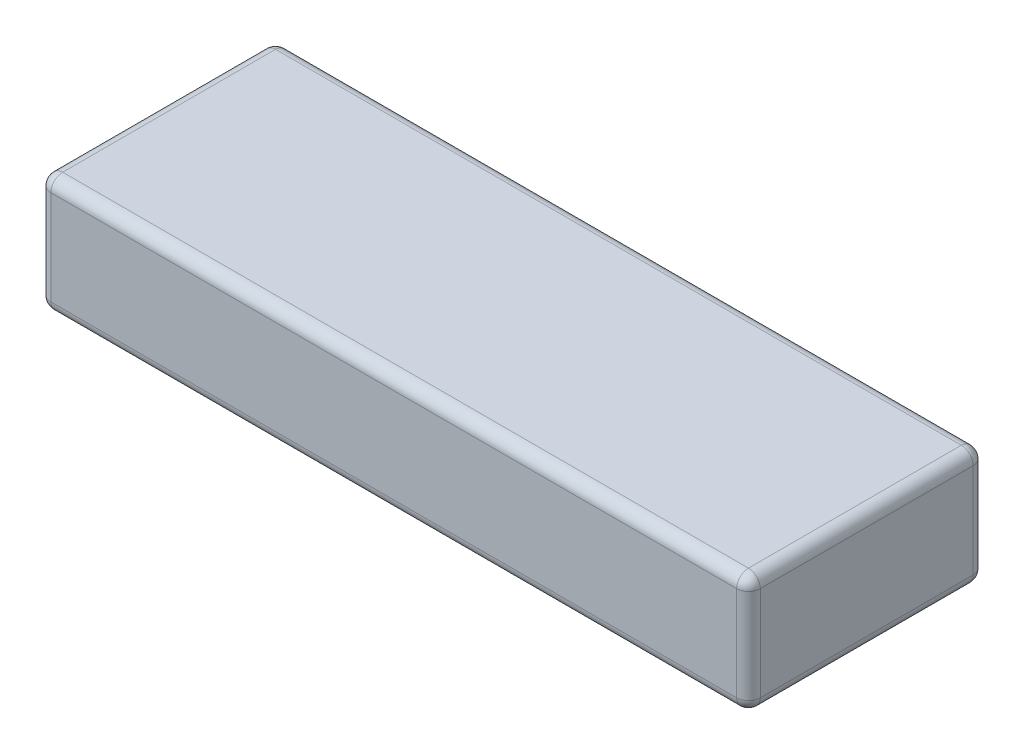
ISO-10303-21;
HEADER;
FILE_DESCRIPTION(('STEP AP214'),'2;1');
FILE_NAME('part.step','',(''),(''),'','','');
FILE_SCHEMA(('AUTOMOTIVE_DESIGN { 1 0 10303 214 1 1 1 1 }'));
ENDSEC;
DATA;
#1=APPLICATION_CONTEXT('core data for automotive mechanical design processes');
#2=APPLICATION_PROTOCOL_DEFINITION('international standard','automotive_design',2000,#1);
#3=PRODUCT_CONTEXT('',#1,'mechanical');
#4=PRODUCT('Part','Part','',(#3));
#5=PRODUCT_RELATED_PRODUCT_CATEGORY('part','',(#4));
#6=PRODUCT_DEFINITION_FORMATION('','',#4);
#7=PRODUCT_DEFINITION_CONTEXT('part definition',#1,'design');
#8=PRODUCT_DEFINITION('design','',#6,#7);
#9=PRODUCT_DEFINITION_SHAPE('','',#8);
#10=(LENGTH_UNIT() NAMED_UNIT(*) SI_UNIT(.MILLI.,.METRE.));
#11=(NAMED_UNIT(*) PLANE_ANGLE_UNIT() SI_UNIT($,.RADIAN.));
#12=(NAMED_UNIT(*) SI_UNIT($,.STERADIAN.) SOLID_ANGLE_UNIT());
#13=UNCERTAINTY_MEASURE_WITH_UNIT(LENGTH_MEASURE(1.E-05),#10,'distance_accuracy_value','');
#14=(GEOMETRIC_REPRESENTATION_CONTEXT(3) GLOBAL_UNCERTAINTY_ASSIGNED_CONTEXT((#13)) GLOBAL_UNIT_ASSIGNED_CONTEXT((#10,
#11,#12)) REPRESENTATION_CONTEXT('',''));
#15=CARTESIAN_POINT('',(0.,0.,0.));
#16=DIRECTION('',(0.,0.,1.));
#17=DIRECTION('',(1.,0.,0.));
#18=AXIS2_PLACEMENT_3D('',#15,#16,#17);
#19=CARTESIAN_POINT('',(15.,5.,5.));
#20=DIRECTION('',(-1.,0.,0.));
#21=DIRECTION('',(0.,0.,1.));
#22=AXIS2_PLACEMENT_3D('',#19,#20,#21);
#23=PLANE('',#22);
#24=DIRECTION('',(0.,0.,-1.));
#25=VECTOR('',#24,1.);
#26=CARTESIAN_POINT('',(15.,0.5,-5.));
#27=LINE('',#26,#25);
#28=CARTESIAN_POINT('',(15.,0.5,4.5));
#29=VERTEX_POINT('',#28);
#30=CARTESIAN_POINT('',(15.,0.5,-4.5));
#31=VERTEX_POINT('',#30);
#32=EDGE_CURVE('E188',#29,#31,#27,.T.);
#33=ORIENTED_EDGE('',*,*,#32,.T.);
#34=DIRECTION('',(0.,-1.,0.));
#35=VECTOR('',#34,1.);
#36=CARTESIAN_POINT('',(15.,5.,-4.5));
#37=LINE('',#36,#35);
#38=CARTESIAN_POINT('',(15.,4.5,-4.5));
#39=VERTEX_POINT('',#38);
#40=EDGE_CURVE('E191',#31,#39,#37,.F.);
#41=ORIENTED_EDGE('',*,*,#40,.T.);
#42=DIRECTION('',(0.,0.,-1.));
#43=VECTOR('',#42,1.);
#44=CARTESIAN_POINT('',(15.,4.5,5.));
#45=LINE('',#44,#43);
#46=CARTESIAN_POINT('',(15.,4.5,4.5));
#47=VERTEX_POINT('',#46);
#48=EDGE_CURVE('E182',#39,#47,#45,.F.);
#49=ORIENTED_EDGE('',*,*,#48,.T.);
#50=DIRECTION('',(0.,-1.,0.));
#51=VECTOR('',#50,1.);
#52=CARTESIAN_POINT('',(15.,5.,4.5));
#53=LINE('',#52,#51);
#54=EDGE_CURVE('E185',#47,#29,#53,.T.);
#55=ORIENTED_EDGE('',*,*,#54,.T.);
#56=EDGE_LOOP('',(#33,#41,#49,#55));
#57=FACE_BOUND('',#56,.T.);
#58=ADVANCED_FACE('F43',(#57),#23,.F.);
#59=CARTESIAN_POINT('',(-15.,5.,-5.));
#60=DIRECTION('',(0.,0.,1.));
#61=DIRECTION('',(1.,0.,0.));
#62=AXIS2_PLACEMENT_3D('',#59,#60,#61);
#63=PLANE('',#62);
#64=DIRECTION('',(0.,-1.,0.));
#65=VECTOR('',#64,1.);
#66=CARTESIAN_POINT('',(14.5,5.,-5.));
#67=LINE('',#66,#65);
#68=CARTESIAN_POINT('',(14.5,4.5,-5.));
#69=VERTEX_POINT('',#68);
#70=CARTESIAN_POINT('',(14.5,0.5,-5.));
#71=VERTEX_POINT('',#70);
#72=EDGE_CURVE('E144',#69,#71,#67,.T.);
#73=ORIENTED_EDGE('',*,*,#72,.T.);
#74=DIRECTION('',(-1.,0.,0.));
#75=VECTOR('',#74,1.);
#76=CARTESIAN_POINT('',(-15.,0.5,-5.));
#77=LINE('',#76,#75);
#78=CARTESIAN_POINT('',(-14.5,0.5,-5.));
#79=VERTEX_POINT('',#78);
#80=EDGE_CURVE('E139',#71,#79,#77,.T.);
#81=ORIENTED_EDGE('',*,*,#80,.T.);
#82=DIRECTION('',(0.,-1.,0.));
#83=VECTOR('',#82,1.);
#84=CARTESIAN_POINT('',(-14.5,5.,-5.));
#85=LINE('',#84,#83);
#86=CARTESIAN_POINT('',(-14.5,4.5,-5.));
#87=VERTEX_POINT('',#86);
#88=EDGE_CURVE('E131',#79,#87,#85,.F.);
#89=ORIENTED_EDGE('',*,*,#88,.T.);
#90=DIRECTION('',(-1.,0.,0.));
#91=VECTOR('',#90,1.);
#92=CARTESIAN_POINT('',(-15.,4.5,-5.));
#93=LINE('',#92,#91);
#94=EDGE_CURVE('E136',#87,#69,#93,.F.);
#95=ORIENTED_EDGE('',*,*,#94,.T.);
#96=EDGE_LOOP('',(#73,#81,#89,#95));
#97=FACE_BOUND('',#96,.T.);
#98=ADVANCED_FACE('F134',(#97),#63,.F.);
#99=CARTESIAN_POINT('',(-15.,5.,5.));
#100=DIRECTION('',(1.,0.,0.));
#101=DIRECTION('',(0.,0.,-1.));
#102=AXIS2_PLACEMENT_3D('',#99,#100,#101);
#103=PLANE('',#102);
#104=DIRECTION('',(0.,0.,1.));
#105=VECTOR('',#104,1.);
#106=CARTESIAN_POINT('',(-15.,4.5,5.));
#107=LINE('',#106,#105);
#108=CARTESIAN_POINT('',(-15.,4.5,4.5));
#109=VERTEX_POINT('',#108);
#110=CARTESIAN_POINT('',(-15.,4.5,-4.5));
#111=VERTEX_POINT('',#110);
#112=EDGE_CURVE('E195',#109,#111,#107,.F.);
#113=ORIENTED_EDGE('',*,*,#112,.T.);
#114=DIRECTION('',(0.,-1.,0.));
#115=VECTOR('',#114,1.);
#116=CARTESIAN_POINT('',(-15.,5.,-4.5));
#117=LINE('',#116,#115);
#118=CARTESIAN_POINT('',(-15.,0.5,-4.5));
#119=VERTEX_POINT('',#118);
#120=EDGE_CURVE('E152',#111,#119,#117,.T.);
#121=ORIENTED_EDGE('',*,*,#120,.T.);
#122=DIRECTION('',(0.,0.,1.));
#123=VECTOR('',#122,1.);
#124=CARTESIAN_POINT('',(-15.,0.5,5.));
#125=LINE('',#124,#123);
#126=CARTESIAN_POINT('',(-15.,0.5,4.5));
#127=VERTEX_POINT('',#126);
#128=EDGE_CURVE('E201',#119,#127,#125,.T.);
#129=ORIENTED_EDGE('',*,*,#128,.T.);
#130=DIRECTION('',(0.,-1.,0.));
#131=VECTOR('',#130,1.);
#132=CARTESIAN_POINT('',(-15.,5.,4.5));
#133=LINE('',#132,#131);
#134=EDGE_CURVE('E198',#127,#109,#133,.F.);
#135=ORIENTED_EDGE('',*,*,#134,.T.);
#136=EDGE_LOOP('',(#113,#121,#129,#135));
#137=FACE_BOUND('',#136,.T.);
#138=ADVANCED_FACE('F382',(#137),#103,.F.);
#139=CARTESIAN_POINT('',(-15.,5.,5.));
#140=DIRECTION('',(0.,0.,-1.));
#141=DIRECTION('',(-1.,0.,0.));
#142=AXIS2_PLACEMENT_3D('',#139,#140,#141);
#143=PLANE('',#142);
#144=DIRECTION('',(0.,-1.,0.));
#145=VECTOR('',#144,1.);
#146=CARTESIAN_POINT('',(-14.5,5.,5.));
#147=LINE('',#146,#145);
#148=CARTESIAN_POINT('',(-14.5,4.5,5.));
#149=VERTEX_POINT('',#148);
#150=CARTESIAN_POINT('',(-14.5,0.5,5.));
#151=VERTEX_POINT('',#150);
#152=EDGE_CURVE('E225',#149,#151,#147,.T.);
#153=ORIENTED_EDGE('',*,*,#152,.T.);
#154=DIRECTION('',(1.,0.,0.));
#155=VECTOR('',#154,1.);
#156=CARTESIAN_POINT('',(15.,0.5,5.));
#157=LINE('',#156,#155);
#158=CARTESIAN_POINT('',(14.5,0.5,5.));
#159=VERTEX_POINT('',#158);
#160=EDGE_CURVE('E229',#151,#159,#157,.T.);
#161=ORIENTED_EDGE('',*,*,#160,.T.);
#162=DIRECTION('',(0.,-1.,0.));
#163=VECTOR('',#162,1.);
#164=CARTESIAN_POINT('',(14.5,5.,5.));
#165=LINE('',#164,#163);
#166=CARTESIAN_POINT('',(14.5,4.5,5.));
#167=VERTEX_POINT('',#166);
#168=EDGE_CURVE('E222',#159,#167,#165,.F.);
#169=ORIENTED_EDGE('',*,*,#168,.T.);
#170=DIRECTION('',(1.,0.,0.));
#171=VECTOR('',#170,1.);
#172=CARTESIAN_POINT('',(-15.,4.5,5.));
#173=LINE('',#172,#171);
#174=EDGE_CURVE('E219',#167,#149,#173,.F.);
#175=ORIENTED_EDGE('',*,*,#174,.T.);
#176=EDGE_LOOP('',(#153,#161,#169,#175));
#177=FACE_BOUND('',#176,.T.);
#178=ADVANCED_FACE('F331',(#177),#143,.F.);
#179=CARTESIAN_POINT('',(0.,5.,0.));
#180=DIRECTION('',(0.,-1.,0.));
#181=DIRECTION('',(0.,0.,-1.));
#182=AXIS2_PLACEMENT_3D('',#179,#180,#181);
#183=PLANE('',#182);
#184=DIRECTION('',(0.,0.,1.));
#185=VECTOR('',#184,1.);
#186=CARTESIAN_POINT('',(-14.5,5.,0.));
#187=LINE('',#186,#185);
#188=CARTESIAN_POINT('',(-14.5,5.,-4.5));
#189=VERTEX_POINT('',#188);
#190=CARTESIAN_POINT('',(-14.5,5.,4.5));
#191=VERTEX_POINT('',#190);
#192=EDGE_CURVE('E53',#189,#191,#187,.T.);
#193=ORIENTED_EDGE('',*,*,#192,.T.);
#194=DIRECTION('',(1.,0.,0.));
#195=VECTOR('',#194,1.);
#196=CARTESIAN_POINT('',(0.,5.,4.5));
#197=LINE('',#196,#195);
#198=CARTESIAN_POINT('',(14.5,5.,4.5));
#199=VERTEX_POINT('',#198);
#200=EDGE_CURVE('E11',#191,#199,#197,.T.);
#201=ORIENTED_EDGE('',*,*,#200,.T.);
#202=DIRECTION('',(0.,0.,-1.));
#203=VECTOR('',#202,1.);
#204=CARTESIAN_POINT('',(14.5,5.,0.));
#205=LINE('',#204,#203);
#206=CARTESIAN_POINT('',(14.5,5.,-4.5));
#207=VERTEX_POINT('',#206);
#208=EDGE_CURVE('E232',#199,#207,#205,.T.);
#209=ORIENTED_EDGE('',*,*,#208,.T.);
#210=DIRECTION('',(-1.,0.,0.));
#211=VECTOR('',#210,1.);
#212=CARTESIAN_POINT('',(0.,5.,-4.5));
#213=LINE('',#212,#211);
#214=EDGE_CURVE('E64',#207,#189,#213,.T.);
#215=ORIENTED_EDGE('',*,*,#214,.T.);
#216=EDGE_LOOP('',(#193,#201,#209,#215));
#217=FACE_BOUND('',#216,.T.);
#218=ADVANCED_FACE('F346',(#217),#183,.F.);
#219=CARTESIAN_POINT('',(0.,0.,0.));
#220=DIRECTION('',(0.,-1.,0.));
#221=DIRECTION('',(0.,0.,-1.));
#222=AXIS2_PLACEMENT_3D('',#219,#220,#221);
#223=PLANE('',#222);
#224=DIRECTION('',(0.,0.,1.));
#225=VECTOR('',#224,1.);
#226=CARTESIAN_POINT('',(-14.5,0.,-5.));
#227=LINE('',#226,#225);
#228=CARTESIAN_POINT('',(-14.5,0.,4.5));
#229=VERTEX_POINT('',#228);
#230=CARTESIAN_POINT('',(-14.5,0.,-4.5));
#231=VERTEX_POINT('',#230);
#232=EDGE_CURVE('E212',#229,#231,#227,.F.);
#233=ORIENTED_EDGE('',*,*,#232,.T.);
#234=DIRECTION('',(-1.,0.,0.));
#235=VECTOR('',#234,1.);
#236=CARTESIAN_POINT('',(15.,0.,-4.5));
#237=LINE('',#236,#235);
#238=CARTESIAN_POINT('',(14.5,0.,-4.5));
#239=VERTEX_POINT('',#238);
#240=EDGE_CURVE('E215',#231,#239,#237,.F.);
#241=ORIENTED_EDGE('',*,*,#240,.T.);
#242=DIRECTION('',(0.,0.,-1.));
#243=VECTOR('',#242,1.);
#244=CARTESIAN_POINT('',(14.5,0.,5.));
#245=LINE('',#244,#243);
#246=CARTESIAN_POINT('',(14.5,0.,4.5));
#247=VERTEX_POINT('',#246);
#248=EDGE_CURVE('E209',#239,#247,#245,.F.);
#249=ORIENTED_EDGE('',*,*,#248,.T.);
#250=DIRECTION('',(1.,0.,0.));
#251=VECTOR('',#250,1.);
#252=CARTESIAN_POINT('',(-15.,0.,4.5));
#253=LINE('',#252,#251);
#254=EDGE_CURVE('E206',#247,#229,#253,.F.);
#255=ORIENTED_EDGE('',*,*,#254,.T.);
#256=EDGE_LOOP('',(#233,#241,#249,#255));
#257=FACE_BOUND('',#256,.T.);
#258=ADVANCED_FACE('F322',(#257),#223,.T.);
#259=CARTESIAN_POINT('',(-14.5,5.,4.5));
#260=DIRECTION('',(0.,-1.,0.));
#261=DIRECTION('',(0.,0.,-1.));
#262=AXIS2_PLACEMENT_3D('',#259,#260,#261);
#263=CYLINDRICAL_SURFACE('',#262,0.5);
#264=CARTESIAN_POINT('',(-14.5,4.5,4.5));
#265=DIRECTION('',(0.,1.,0.));
#266=DIRECTION('',(0.,0.,1.));
#267=AXIS2_PLACEMENT_3D('',#264,#265,#266);
#268=CIRCLE('',#267,0.5);
#269=EDGE_CURVE('E47',#109,#149,#268,.T.);
#270=ORIENTED_EDGE('',*,*,#269,.F.);
#271=ORIENTED_EDGE('',*,*,#134,.F.);
#272=CARTESIAN_POINT('',(-14.5,0.5,4.5));
#273=DIRECTION('',(0.,-1.,0.));
#274=DIRECTION('',(0.,0.,-1.));
#275=AXIS2_PLACEMENT_3D('',#272,#273,#274);
#276=CIRCLE('',#275,0.5);
#277=EDGE_CURVE('E176',#151,#127,#276,.T.);
#278=ORIENTED_EDGE('',*,*,#277,.F.);
#279=ORIENTED_EDGE('',*,*,#152,.F.);
#280=EDGE_LOOP('',(#270,#271,#278,#279));
#281=FACE_BOUND('',#280,.T.);
#282=ADVANCED_FACE('F45',(#281),#263,.T.);
#283=CARTESIAN_POINT('',(-14.5,4.5,4.5));
#284=DIRECTION('',(0.,0.,1.));
#285=DIRECTION('',(1.,0.,0.));
#286=AXIS2_PLACEMENT_3D('',#283,#284,#285);
#287=SPHERICAL_SURFACE('',#286,0.5);
#288=CARTESIAN_POINT('',(-14.5,4.5,4.5));
#289=DIRECTION('',(0.,0.,1.));
#290=DIRECTION('',(1.,0.,0.));
#291=AXIS2_PLACEMENT_3D('',#288,#289,#290);
#292=CIRCLE('',#291,0.5);
#293=EDGE_CURVE('E299',#109,#191,#292,.F.);
#294=ORIENTED_EDGE('',*,*,#293,.F.);
#295=ORIENTED_EDGE('',*,*,#269,.T.);
#296=CARTESIAN_POINT('',(-14.5,4.5,4.5));
#297=DIRECTION('',(-1.,0.,0.));
#298=DIRECTION('',(0.,0.,1.));
#299=AXIS2_PLACEMENT_3D('',#296,#297,#298);
#300=CIRCLE('',#299,0.5);
#301=EDGE_CURVE('E302',#191,#149,#300,.F.);
#302=ORIENTED_EDGE('',*,*,#301,.F.);
#303=EDGE_LOOP('',(#294,#295,#302));
#304=FACE_BOUND('',#303,.T.);
#305=ADVANCED_FACE('F550',(#304),#287,.T.);
#306=CARTESIAN_POINT('',(-14.5,0.5,4.5));
#307=DIRECTION('',(-1.,0.,0.));
#308=DIRECTION('',(0.,-1.,0.));
#309=AXIS2_PLACEMENT_3D('',#306,#307,#308);
#310=SPHERICAL_SURFACE('',#309,0.5);
#311=CARTESIAN_POINT('',(-14.5,0.5,4.5));
#312=DIRECTION('',(-1.,0.,0.));
#313=DIRECTION('',(0.,0.,1.));
#314=AXIS2_PLACEMENT_3D('',#311,#312,#313);
#315=CIRCLE('',#314,0.5);
#316=EDGE_CURVE('E291',#151,#229,#315,.F.);
#317=ORIENTED_EDGE('',*,*,#316,.F.);
#318=ORIENTED_EDGE('',*,*,#277,.T.);
#319=CARTESIAN_POINT('',(-14.5,0.5,4.5));
#320=DIRECTION('',(0.,0.,1.));
#321=DIRECTION('',(1.,0.,0.));
#322=AXIS2_PLACEMENT_3D('',#319,#320,#321);
#323=CIRCLE('',#322,0.5);
#324=EDGE_CURVE('E295',#229,#127,#323,.F.);
#325=ORIENTED_EDGE('',*,*,#324,.F.);
#326=EDGE_LOOP('',(#317,#318,#325));
#327=FACE_BOUND('',#326,.T.);
#328=ADVANCED_FACE('F311',(#327),#310,.T.);
#329=CARTESIAN_POINT('',(0.,4.5,4.5));
#330=DIRECTION('',(1.,0.,0.));
#331=DIRECTION('',(0.,0.,-1.));
#332=AXIS2_PLACEMENT_3D('',#329,#330,#331);
#333=CYLINDRICAL_SURFACE('',#332,0.5);
#334=ORIENTED_EDGE('',*,*,#301,.T.);
#335=ORIENTED_EDGE('',*,*,#174,.F.);
#336=CARTESIAN_POINT('',(14.5,4.5,4.5));
#337=DIRECTION('',(1.,0.,0.));
#338=DIRECTION('',(0.,0.,-1.));
#339=AXIS2_PLACEMENT_3D('',#336,#337,#338);
#340=CIRCLE('',#339,0.5);
#341=EDGE_CURVE('E283',#199,#167,#340,.T.);
#342=ORIENTED_EDGE('',*,*,#341,.F.);
#343=ORIENTED_EDGE('',*,*,#200,.F.);
#344=EDGE_LOOP('',(#334,#335,#342,#343));
#345=FACE_BOUND('',#344,.T.);
#346=ADVANCED_FACE('F345',(#345),#333,.T.);
#347=CARTESIAN_POINT('',(-14.5,4.5,0.));
#348=DIRECTION('',(0.,0.,1.));
#349=DIRECTION('',(1.,0.,0.));
#350=AXIS2_PLACEMENT_3D('',#347,#348,#349);
#351=CYLINDRICAL_SURFACE('',#350,0.5);
#352=ORIENTED_EDGE('',*,*,#293,.T.);
#353=ORIENTED_EDGE('',*,*,#192,.F.);
#354=CARTESIAN_POINT('',(-14.5,4.5,-4.5));
#355=DIRECTION('',(0.,0.,-1.));
#356=DIRECTION('',(0.,1.,0.));
#357=AXIS2_PLACEMENT_3D('',#354,#355,#356);
#358=CIRCLE('',#357,0.5);
#359=EDGE_CURVE('E157',#111,#189,#358,.T.);
#360=ORIENTED_EDGE('',*,*,#359,.F.);
#361=ORIENTED_EDGE('',*,*,#112,.F.);
#362=EDGE_LOOP('',(#352,#353,#360,#361));
#363=FACE_BOUND('',#362,.T.);
#364=ADVANCED_FACE('F521',(#363),#351,.T.);
#365=CARTESIAN_POINT('',(-14.5,5.,-4.5));
#366=DIRECTION('',(0.,-1.,0.));
#367=DIRECTION('',(0.,0.,-1.));
#368=AXIS2_PLACEMENT_3D('',#365,#366,#367);
#369=CYLINDRICAL_SURFACE('',#368,0.5);
#370=CARTESIAN_POINT('',(-14.5,0.5,-4.5));
#371=DIRECTION('',(0.,-1.,0.));
#372=DIRECTION('',(0.,0.,-1.));
#373=AXIS2_PLACEMENT_3D('',#370,#371,#372);
#374=CIRCLE('',#373,0.5);
#375=EDGE_CURVE('E158',#119,#79,#374,.T.);
#376=ORIENTED_EDGE('',*,*,#375,.F.);
#377=ORIENTED_EDGE('',*,*,#120,.F.);
#378=CARTESIAN_POINT('',(-14.5,4.5,-4.5));
#379=DIRECTION('',(0.,1.,0.));
#380=DIRECTION('',(0.,0.,1.));
#381=AXIS2_PLACEMENT_3D('',#378,#379,#380);
#382=CIRCLE('',#381,0.5);
#383=EDGE_CURVE('E148',#87,#111,#382,.T.);
#384=ORIENTED_EDGE('',*,*,#383,.F.);
#385=ORIENTED_EDGE('',*,*,#88,.F.);
#386=EDGE_LOOP('',(#376,#377,#384,#385));
#387=FACE_BOUND('',#386,.T.);
#388=ADVANCED_FACE('F150',(#387),#369,.T.);
#389=CARTESIAN_POINT('',(-14.5,0.5,5.));
#390=DIRECTION('',(0.,0.,-1.));
#391=DIRECTION('',(-1.,0.,0.));
#392=AXIS2_PLACEMENT_3D('',#389,#390,#391);
#393=CYLINDRICAL_SURFACE('',#392,0.5);
#394=ORIENTED_EDGE('',*,*,#324,.T.);
#395=ORIENTED_EDGE('',*,*,#128,.F.);
#396=CARTESIAN_POINT('',(-14.5,0.5,-4.5));
#397=DIRECTION('',(0.,0.,-1.));
#398=DIRECTION('',(-1.,0.,0.));
#399=AXIS2_PLACEMENT_3D('',#396,#397,#398);
#400=CIRCLE('',#399,0.5);
#401=EDGE_CURVE('E276',#231,#119,#400,.T.);
#402=ORIENTED_EDGE('',*,*,#401,.F.);
#403=ORIENTED_EDGE('',*,*,#232,.F.);
#404=EDGE_LOOP('',(#394,#395,#402,#403));
#405=FACE_BOUND('',#404,.T.);
#406=ADVANCED_FACE('F318',(#405),#393,.T.);
#407=CARTESIAN_POINT('',(-15.,0.5,4.5));
#408=DIRECTION('',(-1.,0.,0.));
#409=DIRECTION('',(0.,0.,1.));
#410=AXIS2_PLACEMENT_3D('',#407,#408,#409);
#411=CYLINDRICAL_SURFACE('',#410,0.5);
#412=ORIENTED_EDGE('',*,*,#316,.T.);
#413=ORIENTED_EDGE('',*,*,#254,.F.);
#414=CARTESIAN_POINT('',(14.5,0.5,4.5));
#415=DIRECTION('',(1.,0.,0.));
#416=DIRECTION('',(0.,0.,-1.));
#417=AXIS2_PLACEMENT_3D('',#414,#415,#416);
#418=CIRCLE('',#417,0.5);
#419=EDGE_CURVE('E272',#159,#247,#418,.T.);
#420=ORIENTED_EDGE('',*,*,#419,.F.);
#421=ORIENTED_EDGE('',*,*,#160,.F.);
#422=EDGE_LOOP('',(#412,#413,#420,#421));
#423=FACE_BOUND('',#422,.T.);
#424=ADVANCED_FACE('F328',(#423),#411,.T.);
#425=CARTESIAN_POINT('',(14.5,5.,4.5));
#426=DIRECTION('',(0.,-1.,0.));
#427=DIRECTION('',(0.,0.,-1.));
#428=AXIS2_PLACEMENT_3D('',#425,#426,#427);
#429=CYLINDRICAL_SURFACE('',#428,0.5);
#430=CARTESIAN_POINT('',(14.5,4.5,4.5));
#431=DIRECTION('',(0.,1.,0.));
#432=DIRECTION('',(0.,0.,1.));
#433=AXIS2_PLACEMENT_3D('',#430,#431,#432);
#434=CIRCLE('',#433,0.5);
#435=EDGE_CURVE('E287',#167,#47,#434,.T.);
#436=ORIENTED_EDGE('',*,*,#435,.F.);
#437=ORIENTED_EDGE('',*,*,#168,.F.);
#438=CARTESIAN_POINT('',(14.5,0.5,4.5));
#439=DIRECTION('',(0.,-1.,0.));
#440=DIRECTION('',(0.,0.,-1.));
#441=AXIS2_PLACEMENT_3D('',#438,#439,#440);
#442=CIRCLE('',#441,0.5);
#443=EDGE_CURVE('E268',#29,#159,#442,.T.);
#444=ORIENTED_EDGE('',*,*,#443,.F.);
#445=ORIENTED_EDGE('',*,*,#54,.F.);
#446=EDGE_LOOP('',(#436,#437,#444,#445));
#447=FACE_BOUND('',#446,.T.);
#448=ADVANCED_FACE('F336',(#447),#429,.T.);
#449=CARTESIAN_POINT('',(14.5,4.5,4.5));
#450=DIRECTION('',(0.,0.,1.));
#451=DIRECTION('',(1.,0.,0.));
#452=AXIS2_PLACEMENT_3D('',#449,#450,#451);
#453=SPHERICAL_SURFACE('',#452,0.5);
#454=ORIENTED_EDGE('',*,*,#341,.T.);
#455=ORIENTED_EDGE('',*,*,#435,.T.);
#456=CARTESIAN_POINT('',(14.5,4.5,4.5));
#457=DIRECTION('',(0.,0.,1.));
#458=DIRECTION('',(1.,0.,0.));
#459=AXIS2_PLACEMENT_3D('',#456,#457,#458);
#460=CIRCLE('',#459,0.5);
#461=EDGE_CURVE('E165',#199,#47,#460,.F.);
#462=ORIENTED_EDGE('',*,*,#461,.F.);
#463=EDGE_LOOP('',(#454,#455,#462));
#464=FACE_BOUND('',#463,.T.);
#465=ADVANCED_FACE('F342',(#464),#453,.T.);
#466=CARTESIAN_POINT('',(-14.5,4.5,-4.5));
#467=DIRECTION('',(-1.,0.,0.));
#468=DIRECTION('',(0.,0.,1.));
#469=AXIS2_PLACEMENT_3D('',#466,#467,#468);
#470=SPHERICAL_SURFACE('',#469,0.5);
#471=ORIENTED_EDGE('',*,*,#383,.T.);
#472=ORIENTED_EDGE('',*,*,#359,.T.);
#473=CARTESIAN_POINT('',(-14.5,4.5,-4.5));
#474=DIRECTION('',(-1.,0.,0.));
#475=DIRECTION('',(0.,0.,1.));
#476=AXIS2_PLACEMENT_3D('',#473,#474,#475);
#477=CIRCLE('',#476,0.5);
#478=EDGE_CURVE('E161',#87,#189,#477,.F.);
#479=ORIENTED_EDGE('',*,*,#478,.F.);
#480=EDGE_LOOP('',(#471,#472,#479));
#481=FACE_BOUND('',#480,.T.);
#482=ADVANCED_FACE('F162',(#481),#470,.T.);
#483=CARTESIAN_POINT('',(-14.5,0.5,-4.5));
#484=DIRECTION('',(-1.,0.,0.));
#485=DIRECTION('',(0.,0.,1.));
#486=AXIS2_PLACEMENT_3D('',#483,#484,#485);
#487=SPHERICAL_SURFACE('',#486,0.5);
#488=ORIENTED_EDGE('',*,*,#401,.T.);
#489=ORIENTED_EDGE('',*,*,#375,.T.);
#490=CARTESIAN_POINT('',(-14.5,0.5,-4.5));
#491=DIRECTION('',(-1.,0.,0.));
#492=DIRECTION('',(0.,0.,1.));
#493=AXIS2_PLACEMENT_3D('',#490,#491,#492);
#494=CIRCLE('',#493,0.5);
#495=EDGE_CURVE('E166',#231,#79,#494,.F.);
#496=ORIENTED_EDGE('',*,*,#495,.F.);
#497=EDGE_LOOP('',(#488,#489,#496));
#498=FACE_BOUND('',#497,.T.);
#499=ADVANCED_FACE('F365',(#498),#487,.T.);
#500=CARTESIAN_POINT('',(14.5,0.5,4.5));
#501=DIRECTION('',(0.,0.,1.));
#502=DIRECTION('',(0.,-1.,0.));
#503=AXIS2_PLACEMENT_3D('',#500,#501,#502);
#504=SPHERICAL_SURFACE('',#503,0.5);
#505=ORIENTED_EDGE('',*,*,#443,.T.);
#506=ORIENTED_EDGE('',*,*,#419,.T.);
#507=CARTESIAN_POINT('',(14.5,0.5,4.5));
#508=DIRECTION('',(0.,0.,1.));
#509=DIRECTION('',(1.,0.,0.));
#510=AXIS2_PLACEMENT_3D('',#507,#508,#509);
#511=CIRCLE('',#510,0.5);
#512=EDGE_CURVE('E258',#29,#247,#511,.F.);
#513=ORIENTED_EDGE('',*,*,#512,.F.);
#514=EDGE_LOOP('',(#505,#506,#513));
#515=FACE_BOUND('',#514,.T.);
#516=ADVANCED_FACE('F367',(#515),#504,.T.);
#517=CARTESIAN_POINT('',(14.5,4.5,0.));
#518=DIRECTION('',(0.,0.,-1.));
#519=DIRECTION('',(-1.,0.,0.));
#520=AXIS2_PLACEMENT_3D('',#517,#518,#519);
#521=CYLINDRICAL_SURFACE('',#520,0.5);
#522=ORIENTED_EDGE('',*,*,#461,.T.);
#523=ORIENTED_EDGE('',*,*,#48,.F.);
#524=CARTESIAN_POINT('',(14.5,4.5,-4.5));
#525=DIRECTION('',(0.,0.,-1.));
#526=DIRECTION('',(-1.,0.,0.));
#527=AXIS2_PLACEMENT_3D('',#524,#525,#526);
#528=CIRCLE('',#527,0.5);
#529=EDGE_CURVE('E254',#207,#39,#528,.T.);
#530=ORIENTED_EDGE('',*,*,#529,.F.);
#531=ORIENTED_EDGE('',*,*,#208,.F.);
#532=EDGE_LOOP('',(#522,#523,#530,#531));
#533=FACE_BOUND('',#532,.T.);
#534=ADVANCED_FACE('F350',(#533),#521,.T.);
#535=CARTESIAN_POINT('',(0.,4.5,-4.5));
#536=DIRECTION('',(-1.,0.,0.));
#537=DIRECTION('',(0.,0.,1.));
#538=AXIS2_PLACEMENT_3D('',#535,#536,#537);
#539=CYLINDRICAL_SURFACE('',#538,0.5);
#540=ORIENTED_EDGE('',*,*,#478,.T.);
#541=ORIENTED_EDGE('',*,*,#214,.F.);
#542=CARTESIAN_POINT('',(14.5,4.5,-4.5));
#543=DIRECTION('',(1.,0.,0.));
#544=DIRECTION('',(0.,0.,-1.));
#545=AXIS2_PLACEMENT_3D('',#542,#543,#544);
#546=CIRCLE('',#545,0.5);
#547=EDGE_CURVE('E170',#69,#207,#546,.T.);
#548=ORIENTED_EDGE('',*,*,#547,.F.);
#549=ORIENTED_EDGE('',*,*,#94,.F.);
#550=EDGE_LOOP('',(#540,#541,#548,#549));
#551=FACE_BOUND('',#550,.T.);
#552=ADVANCED_FACE('F168',(#551),#539,.T.);
#553=CARTESIAN_POINT('',(-15.,0.5,-4.5));
#554=DIRECTION('',(1.,0.,0.));
#555=DIRECTION('',(0.,0.,-1.));
#556=AXIS2_PLACEMENT_3D('',#553,#554,#555);
#557=CYLINDRICAL_SURFACE('',#556,0.5);
#558=ORIENTED_EDGE('',*,*,#495,.T.);
#559=ORIENTED_EDGE('',*,*,#80,.F.);
#560=CARTESIAN_POINT('',(14.5,0.5,-4.5));
#561=DIRECTION('',(1.,0.,0.));
#562=DIRECTION('',(0.,0.,-1.));
#563=AXIS2_PLACEMENT_3D('',#560,#561,#562);
#564=CIRCLE('',#563,0.5);
#565=EDGE_CURVE('E248',#239,#71,#564,.T.);
#566=ORIENTED_EDGE('',*,*,#565,.F.);
#567=ORIENTED_EDGE('',*,*,#240,.F.);
#568=EDGE_LOOP('',(#558,#559,#566,#567));
#569=FACE_BOUND('',#568,.T.);
#570=ADVANCED_FACE('F363',(#569),#557,.T.);
#571=CARTESIAN_POINT('',(14.5,0.5,5.));
#572=DIRECTION('',(0.,0.,1.));
#573=DIRECTION('',(1.,0.,0.));
#574=AXIS2_PLACEMENT_3D('',#571,#572,#573);
#575=CYLINDRICAL_SURFACE('',#574,0.5);
#576=ORIENTED_EDGE('',*,*,#512,.T.);
#577=ORIENTED_EDGE('',*,*,#248,.F.);
#578=CARTESIAN_POINT('',(14.5,0.5,-4.5));
#579=DIRECTION('',(0.,0.,-1.));
#580=DIRECTION('',(-1.,0.,0.));
#581=AXIS2_PLACEMENT_3D('',#578,#579,#580);
#582=CIRCLE('',#581,0.5);
#583=EDGE_CURVE('E245',#31,#239,#582,.T.);
#584=ORIENTED_EDGE('',*,*,#583,.F.);
#585=ORIENTED_EDGE('',*,*,#32,.F.);
#586=EDGE_LOOP('',(#576,#577,#584,#585));
#587=FACE_BOUND('',#586,.T.);
#588=ADVANCED_FACE('F392',(#587),#575,.T.);
#589=CARTESIAN_POINT('',(14.5,4.5,-4.5));
#590=DIRECTION('',(0.,1.,0.));
#591=DIRECTION('',(0.,0.,1.));
#592=AXIS2_PLACEMENT_3D('',#589,#590,#591);
#593=SPHERICAL_SURFACE('',#592,0.5);
#594=ORIENTED_EDGE('',*,*,#547,.T.);
#595=ORIENTED_EDGE('',*,*,#529,.T.);
#596=CARTESIAN_POINT('',(14.5,4.5,-4.5));
#597=DIRECTION('',(0.,1.,0.));
#598=DIRECTION('',(0.,0.,1.));
#599=AXIS2_PLACEMENT_3D('',#596,#597,#598);
#600=CIRCLE('',#599,0.5);
#601=EDGE_CURVE('E242',#69,#39,#600,.F.);
#602=ORIENTED_EDGE('',*,*,#601,.F.);
#603=EDGE_LOOP('',(#594,#595,#602));
#604=FACE_BOUND('',#603,.T.);
#605=ADVANCED_FACE('F352',(#604),#593,.T.);
#606=CARTESIAN_POINT('',(14.5,0.5,-4.5));
#607=DIRECTION('',(0.,-1.,0.));
#608=DIRECTION('',(0.,0.,-1.));
#609=AXIS2_PLACEMENT_3D('',#606,#607,#608);
#610=SPHERICAL_SURFACE('',#609,0.5);
#611=ORIENTED_EDGE('',*,*,#583,.T.);
#612=ORIENTED_EDGE('',*,*,#565,.T.);
#613=CARTESIAN_POINT('',(14.5,0.5,-4.5));
#614=DIRECTION('',(0.,-1.,0.));
#615=DIRECTION('',(0.,0.,-1.));
#616=AXIS2_PLACEMENT_3D('',#613,#614,#615);
#617=CIRCLE('',#616,0.5);
#618=EDGE_CURVE('E239',#31,#71,#617,.F.);
#619=ORIENTED_EDGE('',*,*,#618,.F.);
#620=EDGE_LOOP('',(#611,#612,#619));
#621=FACE_BOUND('',#620,.T.);
#622=ADVANCED_FACE('F360',(#621),#610,.T.);
#623=CARTESIAN_POINT('',(14.5,5.,-4.5));
#624=DIRECTION('',(0.,-1.,0.));
#625=DIRECTION('',(0.,0.,-1.));
#626=AXIS2_PLACEMENT_3D('',#623,#624,#625);
#627=CYLINDRICAL_SURFACE('',#626,0.5);
#628=ORIENTED_EDGE('',*,*,#601,.T.);
#629=ORIENTED_EDGE('',*,*,#40,.F.);
#630=ORIENTED_EDGE('',*,*,#618,.T.);
#631=ORIENTED_EDGE('',*,*,#72,.F.);
#632=EDGE_LOOP('',(#628,#629,#630,#631));
#633=FACE_BOUND('',#632,.T.);
#634=ADVANCED_FACE('F356',(#633),#627,.T.);
#635=CLOSED_SHELL('',(#58,#98,#138,#178,#218,#258,#282,#305,#328,#346,#364,#388,#406,#424,#448,
#465,#482,#499,#516,#534,#552,#570,#588,#605,#622,#634));
#636=MANIFOLD_SOLID_BREP('B2',#635);
#637=ADVANCED_BREP_SHAPE_REPRESENTATION('',(#18,#636),#14);
#638=SHAPE_DEFINITION_REPRESENTATION(#9,#637);
ENDSEC;
END-ISO-10303-21;
